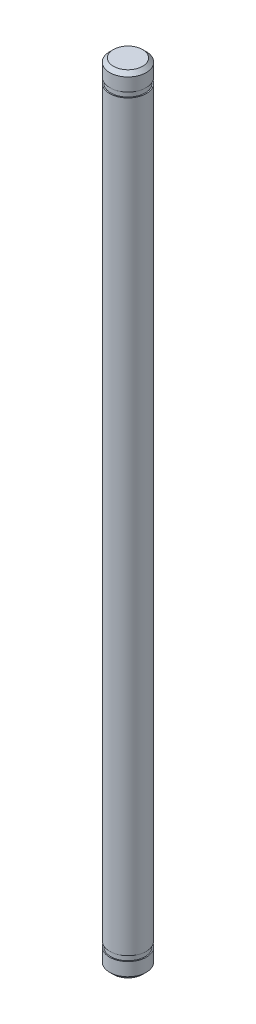
ISO-10303-21;
HEADER;
FILE_DESCRIPTION(('STEP AP214'),'2;1');
FILE_NAME('part.step','',(''),(''),'','','');
FILE_SCHEMA(('AUTOMOTIVE_DESIGN { 1 0 10303 214 1 1 1 1 }'));
ENDSEC;
DATA;
#1=APPLICATION_CONTEXT('core data for automotive mechanical design processes');
#2=APPLICATION_PROTOCOL_DEFINITION('international standard','automotive_design',2000,#1);
#3=PRODUCT_CONTEXT('',#1,'mechanical');
#4=PRODUCT('Part','Part','',(#3));
#5=PRODUCT_RELATED_PRODUCT_CATEGORY('part','',(#4));
#6=PRODUCT_DEFINITION_FORMATION('','',#4);
#7=PRODUCT_DEFINITION_CONTEXT('part definition',#1,'design');
#8=PRODUCT_DEFINITION('design','',#6,#7);
#9=PRODUCT_DEFINITION_SHAPE('','',#8);
#10=(LENGTH_UNIT() NAMED_UNIT(*) SI_UNIT(.MILLI.,.METRE.));
#11=(NAMED_UNIT(*) PLANE_ANGLE_UNIT() SI_UNIT($,.RADIAN.));
#12=(NAMED_UNIT(*) SI_UNIT($,.STERADIAN.) SOLID_ANGLE_UNIT());
#13=UNCERTAINTY_MEASURE_WITH_UNIT(LENGTH_MEASURE(1.E-05),#10,'distance_accuracy_value','');
#14=(GEOMETRIC_REPRESENTATION_CONTEXT(3) GLOBAL_UNCERTAINTY_ASSIGNED_CONTEXT((#13)) GLOBAL_UNIT_ASSIGNED_CONTEXT((#10,
#11,#12)) REPRESENTATION_CONTEXT('',''));
#15=CARTESIAN_POINT('',(0.,0.,0.));
#16=DIRECTION('',(0.,0.,1.));
#17=DIRECTION('',(1.,0.,0.));
#18=AXIS2_PLACEMENT_3D('',#15,#16,#17);
#19=CARTESIAN_POINT('',(0.,108.,0.));
#20=DIRECTION('',(0.,-1.,0.));
#21=DIRECTION('',(0.,0.,-1.));
#22=AXIS2_PLACEMENT_3D('',#19,#20,#21);
#23=CYLINDRICAL_SURFACE('',#22,2.5);
#24=CARTESIAN_POINT('',(0.,105.,0.));
#25=DIRECTION('',(0.,1.,0.));
#26=DIRECTION('',(0.,0.,1.));
#27=AXIS2_PLACEMENT_3D('',#24,#25,#26);
#28=CIRCLE('',#27,2.5);
#29=CARTESIAN_POINT('',(0.,105.,2.5));
#30=VERTEX_POINT('',#29);
#31=EDGE_CURVE('E57',#30,#30,#28,.T.);
#32=ORIENTED_EDGE('',*,*,#31,.F.);
#33=EDGE_LOOP('',(#32));
#34=FACE_BOUND('',#33,.T.);
#35=CARTESIAN_POINT('',(0.,3.,0.));
#36=DIRECTION('',(0.,1.,0.));
#37=DIRECTION('',(0.,0.,1.));
#38=AXIS2_PLACEMENT_3D('',#35,#36,#37);
#39=CIRCLE('',#38,2.5);
#40=CARTESIAN_POINT('',(0.,3.,2.5));
#41=VERTEX_POINT('',#40);
#42=EDGE_CURVE('E69',#41,#41,#39,.T.);
#43=ORIENTED_EDGE('',*,*,#42,.T.);
#44=EDGE_LOOP('',(#43));
#45=FACE_BOUND('',#44,.T.);
#46=ADVANCED_FACE('F35',(#34,#45),#23,.T.);
#47=CARTESIAN_POINT('',(0.,105.7,0.));
#48=DIRECTION('',(0.,1.,0.));
#49=DIRECTION('',(0.,0.,1.));
#50=AXIS2_PLACEMENT_3D('',#47,#48,#49);
#51=CIRCLE('',#50,2.5);
#52=CARTESIAN_POINT('',(0.,105.7,2.5));
#53=VERTEX_POINT('',#52);
#54=EDGE_CURVE('E56',#53,#53,#51,.T.);
#55=ORIENTED_EDGE('',*,*,#54,.T.);
#56=EDGE_LOOP('',(#55));
#57=FACE_BOUND('',#56,.T.);
#58=CARTESIAN_POINT('',(0.,107.5,0.));
#59=DIRECTION('',(0.,1.,0.));
#60=DIRECTION('',(0.,0.,1.));
#61=AXIS2_PLACEMENT_3D('',#58,#59,#60);
#62=CIRCLE('',#61,2.5);
#63=CARTESIAN_POINT('',(0.,107.5,2.5));
#64=VERTEX_POINT('',#63);
#65=EDGE_CURVE('E51',#64,#64,#62,.F.);
#66=ORIENTED_EDGE('',*,*,#65,.T.);
#67=EDGE_LOOP('',(#66));
#68=FACE_BOUND('',#67,.T.);
#69=ADVANCED_FACE('F97',(#57,#68),#23,.T.);
#70=CARTESIAN_POINT('',(0.,108.,0.));
#71=DIRECTION('',(0.,1.,0.));
#72=DIRECTION('',(0.,0.,1.));
#73=AXIS2_PLACEMENT_3D('',#70,#71,#72);
#74=PLANE('',#73);
#75=CARTESIAN_POINT('',(0.,108.,0.));
#76=DIRECTION('',(0.,1.,0.));
#77=DIRECTION('',(0.,0.,1.));
#78=AXIS2_PLACEMENT_3D('',#75,#76,#77);
#79=CIRCLE('',#78,2.);
#80=CARTESIAN_POINT('',(0.,108.,2.));
#81=VERTEX_POINT('',#80);
#82=EDGE_CURVE('E10',#81,#81,#79,.T.);
#83=ORIENTED_EDGE('',*,*,#82,.T.);
#84=EDGE_LOOP('',(#83));
#85=FACE_BOUND('',#84,.T.);
#86=ADVANCED_FACE('F113',(#85),#74,.T.);
#87=CARTESIAN_POINT('',(0.,108.,0.));
#88=DIRECTION('',(0.,-1.,0.));
#89=DIRECTION('',(0.,0.,-1.));
#90=AXIS2_PLACEMENT_3D('',#87,#88,#89);
#91=CONICAL_SURFACE('',#90,2.,0.78539816339746);
#92=ORIENTED_EDGE('',*,*,#65,.F.);
#93=EDGE_LOOP('',(#92));
#94=FACE_BOUND('',#93,.T.);
#95=ORIENTED_EDGE('',*,*,#82,.F.);
#96=EDGE_LOOP('',(#95));
#97=FACE_BOUND('',#96,.T.);
#98=ADVANCED_FACE('F38',(#94,#97),#91,.T.);
#99=CARTESIAN_POINT('',(0.,105.7,0.));
#100=DIRECTION('',(0.,1.,0.));
#101=DIRECTION('',(0.,0.,1.));
#102=AXIS2_PLACEMENT_3D('',#99,#100,#101);
#103=PLANE('',#102);
#104=ORIENTED_EDGE('',*,*,#54,.F.);
#105=EDGE_LOOP('',(#104));
#106=FACE_BOUND('',#105,.T.);
#107=CARTESIAN_POINT('',(0.,105.7,0.));
#108=DIRECTION('',(0.,1.,0.));
#109=DIRECTION('',(0.,0.,1.));
#110=AXIS2_PLACEMENT_3D('',#107,#108,#109);
#111=CIRCLE('',#110,2.35);
#112=CARTESIAN_POINT('',(0.,105.7,2.35));
#113=VERTEX_POINT('',#112);
#114=EDGE_CURVE('E60',#113,#113,#111,.T.);
#115=ORIENTED_EDGE('',*,*,#114,.T.);
#116=EDGE_LOOP('',(#115));
#117=FACE_BOUND('',#116,.T.);
#118=ADVANCED_FACE('F123',(#106,#117),#103,.F.);
#119=CARTESIAN_POINT('',(0.,105.,0.));
#120=DIRECTION('',(0.,1.,0.));
#121=DIRECTION('',(0.,0.,1.));
#122=AXIS2_PLACEMENT_3D('',#119,#120,#121);
#123=PLANE('',#122);
#124=ORIENTED_EDGE('',*,*,#31,.T.);
#125=EDGE_LOOP('',(#124));
#126=FACE_BOUND('',#125,.T.);
#127=CARTESIAN_POINT('',(0.,105.,0.));
#128=DIRECTION('',(0.,1.,0.));
#129=DIRECTION('',(0.,0.,1.));
#130=AXIS2_PLACEMENT_3D('',#127,#128,#129);
#131=CIRCLE('',#130,2.35);
#132=CARTESIAN_POINT('',(0.,105.,2.35));
#133=VERTEX_POINT('',#132);
#134=EDGE_CURVE('E63',#133,#133,#131,.T.);
#135=ORIENTED_EDGE('',*,*,#134,.F.);
#136=EDGE_LOOP('',(#135));
#137=FACE_BOUND('',#136,.T.);
#138=ADVANCED_FACE('F120',(#126,#137),#123,.T.);
#139=CARTESIAN_POINT('',(0.,105.7,0.));
#140=DIRECTION('',(0.,-1.,0.));
#141=DIRECTION('',(0.,0.,-1.));
#142=AXIS2_PLACEMENT_3D('',#139,#140,#141);
#143=CYLINDRICAL_SURFACE('',#142,2.35);
#144=ORIENTED_EDGE('',*,*,#114,.F.);
#145=EDGE_LOOP('',(#144));
#146=FACE_BOUND('',#145,.T.);
#147=ORIENTED_EDGE('',*,*,#134,.T.);
#148=EDGE_LOOP('',(#147));
#149=FACE_BOUND('',#148,.T.);
#150=ADVANCED_FACE('F88',(#146,#149),#143,.T.);
#151=CARTESIAN_POINT('',(0.,2.3,0.));
#152=DIRECTION('',(0.,-1.,0.));
#153=DIRECTION('',(0.,0.,1.));
#154=AXIS2_PLACEMENT_3D('',#151,#152,#153);
#155=PLANE('',#154);
#156=CARTESIAN_POINT('',(0.,2.3,0.));
#157=DIRECTION('',(0.,1.,0.));
#158=DIRECTION('',(0.,0.,1.));
#159=AXIS2_PLACEMENT_3D('',#156,#157,#158);
#160=CIRCLE('',#159,2.35);
#161=CARTESIAN_POINT('',(0.,2.3,2.35));
#162=VERTEX_POINT('',#161);
#163=EDGE_CURVE('E72',#162,#162,#160,.T.);
#164=ORIENTED_EDGE('',*,*,#163,.F.);
#165=EDGE_LOOP('',(#164));
#166=FACE_BOUND('',#165,.T.);
#167=CARTESIAN_POINT('',(0.,2.3,0.));
#168=DIRECTION('',(0.,1.,0.));
#169=DIRECTION('',(0.,0.,1.));
#170=AXIS2_PLACEMENT_3D('',#167,#168,#169);
#171=CIRCLE('',#170,2.5);
#172=CARTESIAN_POINT('',(0.,2.3,2.5));
#173=VERTEX_POINT('',#172);
#174=EDGE_CURVE('E66',#173,#173,#171,.T.);
#175=ORIENTED_EDGE('',*,*,#174,.T.);
#176=EDGE_LOOP('',(#175));
#177=FACE_BOUND('',#176,.T.);
#178=ADVANCED_FACE('F84',(#166,#177),#155,.F.);
#179=CARTESIAN_POINT('',(0.,3.,0.));
#180=DIRECTION('',(0.,-1.,0.));
#181=DIRECTION('',(0.,0.,1.));
#182=AXIS2_PLACEMENT_3D('',#179,#180,#181);
#183=PLANE('',#182);
#184=CARTESIAN_POINT('',(0.,3.,0.));
#185=DIRECTION('',(0.,1.,0.));
#186=DIRECTION('',(0.,0.,1.));
#187=AXIS2_PLACEMENT_3D('',#184,#185,#186);
#188=CIRCLE('',#187,2.35);
#189=CARTESIAN_POINT('',(0.,3.,2.35));
#190=VERTEX_POINT('',#189);
#191=EDGE_CURVE('E75',#190,#190,#188,.T.);
#192=ORIENTED_EDGE('',*,*,#191,.T.);
#193=EDGE_LOOP('',(#192));
#194=FACE_BOUND('',#193,.T.);
#195=ORIENTED_EDGE('',*,*,#42,.F.);
#196=EDGE_LOOP('',(#195));
#197=FACE_BOUND('',#196,.T.);
#198=ADVANCED_FACE('F87',(#194,#197),#183,.T.);
#199=CARTESIAN_POINT('',(0.,2.3,0.));
#200=DIRECTION('',(0.,1.,0.));
#201=DIRECTION('',(0.,0.,1.));
#202=AXIS2_PLACEMENT_3D('',#199,#200,#201);
#203=CYLINDRICAL_SURFACE('',#202,2.35);
#204=ORIENTED_EDGE('',*,*,#163,.T.);
#205=EDGE_LOOP('',(#204));
#206=FACE_BOUND('',#205,.T.);
#207=ORIENTED_EDGE('',*,*,#191,.F.);
#208=EDGE_LOOP('',(#207));
#209=FACE_BOUND('',#208,.T.);
#210=ADVANCED_FACE('F81',(#206,#209),#203,.T.);
#211=CARTESIAN_POINT('',(0.,0.,0.));
#212=DIRECTION('',(0.,1.,0.));
#213=DIRECTION('',(0.,0.,1.));
#214=AXIS2_PLACEMENT_3D('',#211,#212,#213);
#215=PLANE('',#214);
#216=CARTESIAN_POINT('',(0.,0.,0.));
#217=DIRECTION('',(0.,1.,0.));
#218=DIRECTION('',(0.,0.,1.));
#219=AXIS2_PLACEMENT_3D('',#216,#217,#218);
#220=CIRCLE('',#219,2.00000000000002);
#221=CARTESIAN_POINT('',(0.,0.,2.00000000000002));
#222=VERTEX_POINT('',#221);
#223=EDGE_CURVE('E43',#222,#222,#220,.F.);
#224=ORIENTED_EDGE('',*,*,#223,.T.);
#225=EDGE_LOOP('',(#224));
#226=FACE_BOUND('',#225,.T.);
#227=ADVANCED_FACE('F101',(#226),#215,.F.);
#228=CARTESIAN_POINT('',(0.,0.499999999999987,0.));
#229=DIRECTION('',(0.,1.,0.));
#230=DIRECTION('',(0.,0.,1.));
#231=AXIS2_PLACEMENT_3D('',#228,#229,#230);
#232=CONICAL_SURFACE('',#231,2.5,0.785398163397446);
#233=ORIENTED_EDGE('',*,*,#223,.F.);
#234=EDGE_LOOP('',(#233));
#235=FACE_BOUND('',#234,.T.);
#236=CARTESIAN_POINT('',(0.,0.499999999999987,0.));
#237=DIRECTION('',(0.,1.,0.));
#238=DIRECTION('',(0.,0.,1.));
#239=AXIS2_PLACEMENT_3D('',#236,#237,#238);
#240=CIRCLE('',#239,2.5);
#241=CARTESIAN_POINT('',(0.,0.499999999999987,2.5));
#242=VERTEX_POINT('',#241);
#243=EDGE_CURVE('E47',#242,#242,#240,.T.);
#244=ORIENTED_EDGE('',*,*,#243,.F.);
#245=EDGE_LOOP('',(#244));
#246=FACE_BOUND('',#245,.T.);
#247=ADVANCED_FACE('F95',(#235,#246),#232,.T.);
#248=ORIENTED_EDGE('',*,*,#174,.F.);
#249=EDGE_LOOP('',(#248));
#250=FACE_BOUND('',#249,.T.);
#251=ORIENTED_EDGE('',*,*,#243,.T.);
#252=EDGE_LOOP('',(#251));
#253=FACE_BOUND('',#252,.T.);
#254=ADVANCED_FACE('F92',(#250,#253),#23,.T.);
#255=CLOSED_SHELL('',(#46,#69,#86,#98,#118,#138,#150,#178,#198,#210,#227,#247,#254));
#256=MANIFOLD_SOLID_BREP('B2',#255);
#257=ADVANCED_BREP_SHAPE_REPRESENTATION('',(#18,#256),#14);
#258=SHAPE_DEFINITION_REPRESENTATION(#9,#257);
ENDSEC;
END-ISO-10303-21;
